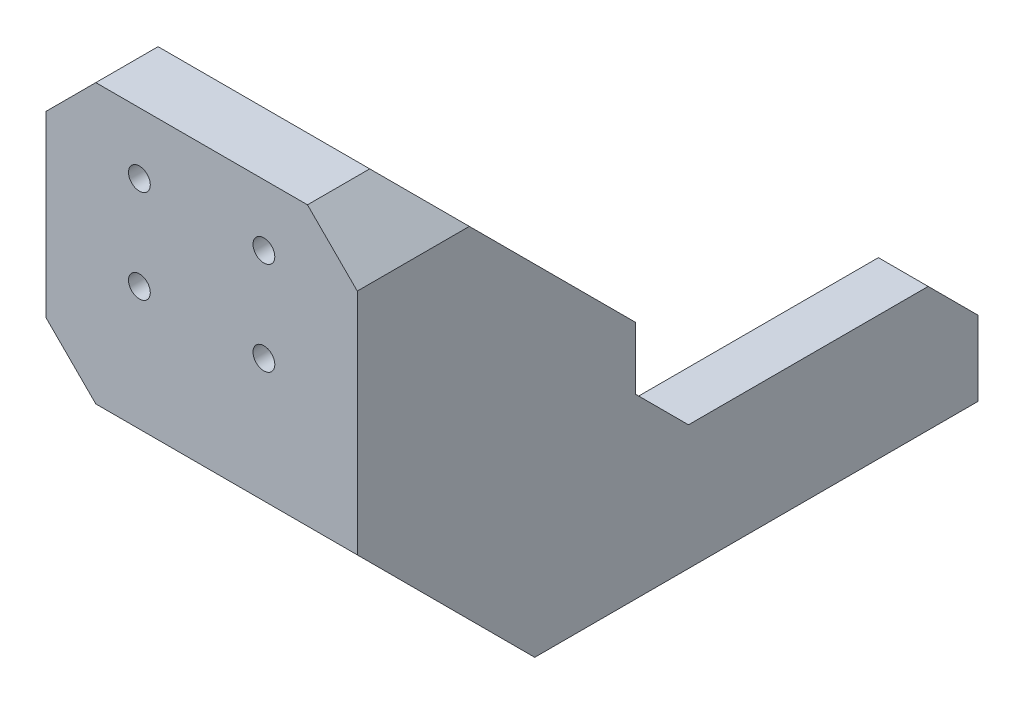
ISO-10303-21;
HEADER;
FILE_DESCRIPTION(('STEP AP214'),'2;1');
FILE_NAME('part.step','',(''),(''),'','','');
FILE_SCHEMA(('AUTOMOTIVE_DESIGN { 1 0 10303 214 1 1 1 1 }'));
ENDSEC;
DATA;
#1=APPLICATION_CONTEXT('core data for automotive mechanical design processes');
#2=APPLICATION_PROTOCOL_DEFINITION('international standard','automotive_design',2000,#1);
#3=PRODUCT_CONTEXT('',#1,'mechanical');
#4=PRODUCT('Part','Part','',(#3));
#5=PRODUCT_RELATED_PRODUCT_CATEGORY('part','',(#4));
#6=PRODUCT_DEFINITION_FORMATION('','',#4);
#7=PRODUCT_DEFINITION_CONTEXT('part definition',#1,'design');
#8=PRODUCT_DEFINITION('design','',#6,#7);
#9=PRODUCT_DEFINITION_SHAPE('','',#8);
#10=(LENGTH_UNIT() NAMED_UNIT(*) SI_UNIT(.MILLI.,.METRE.));
#11=(NAMED_UNIT(*) PLANE_ANGLE_UNIT() SI_UNIT($,.RADIAN.));
#12=(NAMED_UNIT(*) SI_UNIT($,.STERADIAN.) SOLID_ANGLE_UNIT());
#13=UNCERTAINTY_MEASURE_WITH_UNIT(LENGTH_MEASURE(1.E-05),#10,'distance_accuracy_value','');
#14=(GEOMETRIC_REPRESENTATION_CONTEXT(3) GLOBAL_UNCERTAINTY_ASSIGNED_CONTEXT((#13)) GLOBAL_UNIT_ASSIGNED_CONTEXT((#10,
#11,#12)) REPRESENTATION_CONTEXT('',''));
#15=CARTESIAN_POINT('',(0.,0.,0.));
#16=DIRECTION('',(0.,0.,1.));
#17=DIRECTION('',(1.,0.,0.));
#18=AXIS2_PLACEMENT_3D('',#15,#16,#17);
#19=CARTESIAN_POINT('',(0.,10.,0.));
#20=DIRECTION('',(0.,-1.,0.));
#21=DIRECTION('',(0.,0.,-1.));
#22=AXIS2_PLACEMENT_3D('',#19,#20,#21);
#23=PLANE('',#22);
#24=CARTESIAN_POINT('',(-10.,10.,-7.5));
#25=DIRECTION('',(0.,1.,0.));
#26=DIRECTION('',(0.,0.,1.));
#27=AXIS2_PLACEMENT_3D('',#24,#25,#26);
#28=CIRCLE('',#27,3.);
#29=CARTESIAN_POINT('',(-10.,10.,-4.5));
#30=VERTEX_POINT('',#29);
#31=EDGE_CURVE('E269',#30,#30,#28,.T.);
#32=ORIENTED_EDGE('',*,*,#31,.F.);
#33=EDGE_LOOP('',(#32));
#34=FACE_BOUND('',#33,.T.);
#35=CARTESIAN_POINT('',(10.,10.,7.5));
#36=DIRECTION('',(0.,1.,0.));
#37=DIRECTION('',(0.,0.,1.));
#38=AXIS2_PLACEMENT_3D('',#35,#36,#37);
#39=CIRCLE('',#38,3.);
#40=CARTESIAN_POINT('',(10.,10.,10.5));
#41=VERTEX_POINT('',#40);
#42=EDGE_CURVE('E275',#41,#41,#39,.T.);
#43=ORIENTED_EDGE('',*,*,#42,.F.);
#44=EDGE_LOOP('',(#43));
#45=FACE_BOUND('',#44,.T.);
#46=CARTESIAN_POINT('',(-10.,10.,7.5));
#47=DIRECTION('',(0.,1.,0.));
#48=DIRECTION('',(0.,0.,1.));
#49=AXIS2_PLACEMENT_3D('',#46,#47,#48);
#50=CIRCLE('',#49,3.);
#51=CARTESIAN_POINT('',(-10.,10.,10.5));
#52=VERTEX_POINT('',#51);
#53=EDGE_CURVE('E276',#52,#52,#50,.T.);
#54=ORIENTED_EDGE('',*,*,#53,.F.);
#55=EDGE_LOOP('',(#54));
#56=FACE_BOUND('',#55,.T.);
#57=CARTESIAN_POINT('',(10.,10.,-7.5));
#58=DIRECTION('',(0.,1.,0.));
#59=DIRECTION('',(0.,0.,1.));
#60=AXIS2_PLACEMENT_3D('',#57,#58,#59);
#61=CIRCLE('',#60,3.);
#62=CARTESIAN_POINT('',(10.,10.,-4.5));
#63=VERTEX_POINT('',#62);
#64=EDGE_CURVE('E266',#63,#63,#61,.T.);
#65=ORIENTED_EDGE('',*,*,#64,.F.);
#66=EDGE_LOOP('',(#65));
#67=FACE_BOUND('',#66,.T.);
#68=DIRECTION('',(0.,0.,-1.));
#69=VECTOR('',#68,1.);
#70=CARTESIAN_POINT('',(-17.,10.,-17.35));
#71=LINE('',#70,#69);
#72=CARTESIAN_POINT('',(-17.,10.,17.35));
#73=VERTEX_POINT('',#72);
#74=CARTESIAN_POINT('',(-17.,10.,-17.35));
#75=VERTEX_POINT('',#74);
#76=EDGE_CURVE('E196',#73,#75,#71,.T.);
#77=ORIENTED_EDGE('',*,*,#76,.F.);
#78=DIRECTION('',(1.,0.,0.));
#79=VECTOR('',#78,1.);
#80=CARTESIAN_POINT('',(-25.,10.,17.35));
#81=LINE('',#80,#79);
#82=CARTESIAN_POINT('',(17.,10.,17.35));
#83=VERTEX_POINT('',#82);
#84=EDGE_CURVE('E191',#73,#83,#81,.T.);
#85=ORIENTED_EDGE('',*,*,#84,.T.);
#86=DIRECTION('',(0.,0.,-1.));
#87=VECTOR('',#86,1.);
#88=CARTESIAN_POINT('',(17.,10.,-17.35));
#89=LINE('',#88,#87);
#90=CARTESIAN_POINT('',(17.,10.,-17.35));
#91=VERTEX_POINT('',#90);
#92=EDGE_CURVE('E341',#83,#91,#89,.T.);
#93=ORIENTED_EDGE('',*,*,#92,.T.);
#94=DIRECTION('',(-1.,0.,0.));
#95=VECTOR('',#94,1.);
#96=CARTESIAN_POINT('',(-25.,10.,-17.35));
#97=LINE('',#96,#95);
#98=EDGE_CURVE('E249',#91,#75,#97,.T.);
#99=ORIENTED_EDGE('',*,*,#98,.T.);
#100=EDGE_LOOP('',(#77,#85,#93,#99));
#101=FACE_BOUND('',#100,.T.);
#102=ADVANCED_FACE('F41',(#34,#45,#56,#67,#101),#23,.F.);
#103=CARTESIAN_POINT('',(-25.,44.7,17.35));
#104=DIRECTION('',(0.,0.,-1.));
#105=DIRECTION('',(-1.,0.,0.));
#106=AXIS2_PLACEMENT_3D('',#103,#104,#105);
#107=PLANE('',#106);
#108=CARTESIAN_POINT('',(10.,19.85,17.35));
#109=DIRECTION('',(0.,0.,-1.));
#110=DIRECTION('',(-1.,0.,0.));
#111=AXIS2_PLACEMENT_3D('',#108,#109,#110);
#112=CIRCLE('',#111,1.75);
#113=CARTESIAN_POINT('',(8.25,19.85,17.35));
#114=VERTEX_POINT('',#113);
#115=EDGE_CURVE('E354',#114,#114,#112,.T.);
#116=ORIENTED_EDGE('',*,*,#115,.F.);
#117=EDGE_LOOP('',(#116));
#118=FACE_BOUND('',#117,.T.);
#119=CARTESIAN_POINT('',(-10.,19.85,17.35));
#120=DIRECTION('',(0.,0.,-1.));
#121=DIRECTION('',(-1.,0.,0.));
#122=AXIS2_PLACEMENT_3D('',#119,#120,#121);
#123=CIRCLE('',#122,1.75);
#124=CARTESIAN_POINT('',(-11.75,19.85,17.35));
#125=VERTEX_POINT('',#124);
#126=EDGE_CURVE('E360',#125,#125,#123,.T.);
#127=ORIENTED_EDGE('',*,*,#126,.F.);
#128=EDGE_LOOP('',(#127));
#129=FACE_BOUND('',#128,.T.);
#130=CARTESIAN_POINT('',(-10.,34.85,17.35));
#131=DIRECTION('',(0.,0.,-1.));
#132=DIRECTION('',(-1.,0.,0.));
#133=AXIS2_PLACEMENT_3D('',#130,#131,#132);
#134=CIRCLE('',#133,1.75);
#135=CARTESIAN_POINT('',(-11.75,34.85,17.35));
#136=VERTEX_POINT('',#135);
#137=EDGE_CURVE('E366',#136,#136,#134,.T.);
#138=ORIENTED_EDGE('',*,*,#137,.F.);
#139=EDGE_LOOP('',(#138));
#140=FACE_BOUND('',#139,.T.);
#141=CARTESIAN_POINT('',(10.,34.85,17.35));
#142=DIRECTION('',(0.,0.,-1.));
#143=DIRECTION('',(-1.,0.,0.));
#144=AXIS2_PLACEMENT_3D('',#141,#142,#143);
#145=CIRCLE('',#144,1.75);
#146=CARTESIAN_POINT('',(8.25,34.85,17.35));
#147=VERTEX_POINT('',#146);
#148=EDGE_CURVE('E346',#147,#147,#145,.T.);
#149=ORIENTED_EDGE('',*,*,#148,.F.);
#150=EDGE_LOOP('',(#149));
#151=FACE_BOUND('',#150,.T.);
#152=ORIENTED_EDGE('',*,*,#84,.F.);
#153=DIRECTION('',(0.,-1.,0.));
#154=VECTOR('',#153,1.);
#155=CARTESIAN_POINT('',(-17.,10.,17.35));
#156=LINE('',#155,#154);
#157=CARTESIAN_POINT('',(-17.,44.7,17.35));
#158=VERTEX_POINT('',#157);
#159=EDGE_CURVE('E189',#158,#73,#156,.T.);
#160=ORIENTED_EDGE('',*,*,#159,.F.);
#161=DIRECTION('',(1.,0.,0.));
#162=VECTOR('',#161,1.);
#163=CARTESIAN_POINT('',(-25.,44.7,17.35));
#164=LINE('',#163,#162);
#165=CARTESIAN_POINT('',(17.,44.7,17.35));
#166=VERTEX_POINT('',#165);
#167=EDGE_CURVE('E174',#158,#166,#164,.T.);
#168=ORIENTED_EDGE('',*,*,#167,.T.);
#169=DIRECTION('',(0.,-1.,0.));
#170=VECTOR('',#169,1.);
#171=CARTESIAN_POINT('',(17.,10.,17.35));
#172=LINE('',#171,#170);
#173=EDGE_CURVE('E338',#166,#83,#172,.T.);
#174=ORIENTED_EDGE('',*,*,#173,.T.);
#175=EDGE_LOOP('',(#152,#160,#168,#174));
#176=FACE_BOUND('',#175,.T.);
#177=ADVANCED_FACE('F190',(#118,#129,#140,#151,#176),#107,.T.);
#178=CARTESIAN_POINT('',(0.,0.,0.));
#179=DIRECTION('',(0.,-1.,0.));
#180=DIRECTION('',(0.,0.,-1.));
#181=AXIS2_PLACEMENT_3D('',#178,#179,#180);
#182=PLANE('',#181);
#183=CARTESIAN_POINT('',(-10.,0.,7.5));
#184=DIRECTION('',(0.,-1.,0.));
#185=DIRECTION('',(0.,0.,-1.));
#186=AXIS2_PLACEMENT_3D('',#183,#184,#185);
#187=CIRCLE('',#186,1.75);
#188=CARTESIAN_POINT('',(-10.,0.,5.75));
#189=VERTEX_POINT('',#188);
#190=EDGE_CURVE('E230',#189,#189,#187,.F.);
#191=ORIENTED_EDGE('',*,*,#190,.T.);
#192=EDGE_LOOP('',(#191));
#193=FACE_BOUND('',#192,.T.);
#194=CARTESIAN_POINT('',(10.,0.,7.5));
#195=DIRECTION('',(0.,-1.,0.));
#196=DIRECTION('',(0.,0.,-1.));
#197=AXIS2_PLACEMENT_3D('',#194,#195,#196);
#198=CIRCLE('',#197,1.75);
#199=CARTESIAN_POINT('',(10.,0.,5.75));
#200=VERTEX_POINT('',#199);
#201=EDGE_CURVE('E261',#200,#200,#198,.F.);
#202=ORIENTED_EDGE('',*,*,#201,.T.);
#203=EDGE_LOOP('',(#202));
#204=FACE_BOUND('',#203,.T.);
#205=CARTESIAN_POINT('',(10.,0.,-7.5));
#206=DIRECTION('',(0.,-1.,0.));
#207=DIRECTION('',(0.,0.,-1.));
#208=AXIS2_PLACEMENT_3D('',#205,#206,#207);
#209=CIRCLE('',#208,1.75);
#210=CARTESIAN_POINT('',(10.,0.,-9.25));
#211=VERTEX_POINT('',#210);
#212=EDGE_CURVE('E258',#211,#211,#209,.F.);
#213=ORIENTED_EDGE('',*,*,#212,.T.);
#214=EDGE_LOOP('',(#213));
#215=FACE_BOUND('',#214,.T.);
#216=CARTESIAN_POINT('',(-10.,0.,-7.5));
#217=DIRECTION('',(0.,-1.,0.));
#218=DIRECTION('',(0.,0.,-1.));
#219=AXIS2_PLACEMENT_3D('',#216,#217,#218);
#220=CIRCLE('',#219,1.75);
#221=CARTESIAN_POINT('',(-10.,0.,-9.25));
#222=VERTEX_POINT('',#221);
#223=EDGE_CURVE('E255',#222,#222,#220,.F.);
#224=ORIENTED_EDGE('',*,*,#223,.T.);
#225=EDGE_LOOP('',(#224));
#226=FACE_BOUND('',#225,.T.);
#227=DIRECTION('',(-1.,0.,0.));
#228=VECTOR('',#227,1.);
#229=CARTESIAN_POINT('',(-25.,0.,27.35));
#230=LINE('',#229,#228);
#231=CARTESIAN_POINT('',(17.,0.,27.35));
#232=VERTEX_POINT('',#231);
#233=CARTESIAN_POINT('',(-17.,0.,27.35));
#234=VERTEX_POINT('',#233);
#235=EDGE_CURVE('E296',#232,#234,#230,.T.);
#236=ORIENTED_EDGE('',*,*,#235,.T.);
#237=DIRECTION('',(0.,0.,-1.));
#238=VECTOR('',#237,1.);
#239=CARTESIAN_POINT('',(-17.,0.,-17.35));
#240=LINE('',#239,#238);
#241=CARTESIAN_POINT('',(-17.,0.,-17.35));
#242=VERTEX_POINT('',#241);
#243=EDGE_CURVE('E63',#234,#242,#240,.T.);
#244=ORIENTED_EDGE('',*,*,#243,.T.);
#245=DIRECTION('',(-1.,0.,0.));
#246=VECTOR('',#245,1.);
#247=CARTESIAN_POINT('',(-25.,0.,-17.35));
#248=LINE('',#247,#246);
#249=CARTESIAN_POINT('',(17.,0.,-17.35));
#250=VERTEX_POINT('',#249);
#251=EDGE_CURVE('E250',#250,#242,#248,.T.);
#252=ORIENTED_EDGE('',*,*,#251,.F.);
#253=DIRECTION('',(0.,0.,1.));
#254=VECTOR('',#253,1.);
#255=CARTESIAN_POINT('',(17.,0.,27.35));
#256=LINE('',#255,#254);
#257=EDGE_CURVE('E301',#250,#232,#256,.T.);
#258=ORIENTED_EDGE('',*,*,#257,.T.);
#259=EDGE_LOOP('',(#236,#244,#252,#258));
#260=FACE_BOUND('',#259,.T.);
#261=ADVANCED_FACE('F385',(#193,#204,#215,#226,#260),#182,.T.);
#262=CARTESIAN_POINT('',(-10.,-0.000999999999999265,-7.5));
#263=DIRECTION('',(0.,1.,0.));
#264=DIRECTION('',(0.,0.,1.));
#265=AXIS2_PLACEMENT_3D('',#262,#263,#264);
#266=CYLINDRICAL_SURFACE('',#265,1.75);
#267=ORIENTED_EDGE('',*,*,#223,.F.);
#268=EDGE_LOOP('',(#267));
#269=FACE_BOUND('',#268,.T.);
#270=CARTESIAN_POINT('',(-10.,5.,-7.5));
#271=DIRECTION('',(0.,1.,0.));
#272=DIRECTION('',(0.,0.,1.));
#273=AXIS2_PLACEMENT_3D('',#270,#271,#272);
#274=CIRCLE('',#273,1.75);
#275=CARTESIAN_POINT('',(-10.,5.,-5.75));
#276=VERTEX_POINT('',#275);
#277=EDGE_CURVE('E227',#276,#276,#274,.F.);
#278=ORIENTED_EDGE('',*,*,#277,.F.);
#279=EDGE_LOOP('',(#278));
#280=FACE_BOUND('',#279,.T.);
#281=ADVANCED_FACE('F409',(#269,#280),#266,.F.);
#282=CARTESIAN_POINT('',(10.,-0.000999999999999265,-7.5));
#283=DIRECTION('',(0.,1.,0.));
#284=DIRECTION('',(0.,0.,1.));
#285=AXIS2_PLACEMENT_3D('',#282,#283,#284);
#286=CYLINDRICAL_SURFACE('',#285,1.75);
#287=ORIENTED_EDGE('',*,*,#212,.F.);
#288=EDGE_LOOP('',(#287));
#289=FACE_BOUND('',#288,.T.);
#290=CARTESIAN_POINT('',(10.,5.,-7.5));
#291=DIRECTION('',(0.,1.,0.));
#292=DIRECTION('',(0.,0.,1.));
#293=AXIS2_PLACEMENT_3D('',#290,#291,#292);
#294=CIRCLE('',#293,1.75);
#295=CARTESIAN_POINT('',(10.,5.,-5.75));
#296=VERTEX_POINT('',#295);
#297=EDGE_CURVE('E231',#296,#296,#294,.F.);
#298=ORIENTED_EDGE('',*,*,#297,.F.);
#299=EDGE_LOOP('',(#298));
#300=FACE_BOUND('',#299,.T.);
#301=ADVANCED_FACE('F548',(#289,#300),#286,.F.);
#302=CARTESIAN_POINT('',(10.,-0.000999999999999265,7.5));
#303=DIRECTION('',(0.,1.,0.));
#304=DIRECTION('',(0.,0.,1.));
#305=AXIS2_PLACEMENT_3D('',#302,#303,#304);
#306=CYLINDRICAL_SURFACE('',#305,1.75);
#307=ORIENTED_EDGE('',*,*,#201,.F.);
#308=EDGE_LOOP('',(#307));
#309=FACE_BOUND('',#308,.T.);
#310=CARTESIAN_POINT('',(10.,5.,7.5));
#311=DIRECTION('',(0.,1.,0.));
#312=DIRECTION('',(0.,0.,1.));
#313=AXIS2_PLACEMENT_3D('',#310,#311,#312);
#314=CIRCLE('',#313,1.75);
#315=CARTESIAN_POINT('',(10.,5.,9.25));
#316=VERTEX_POINT('',#315);
#317=EDGE_CURVE('E234',#316,#316,#314,.F.);
#318=ORIENTED_EDGE('',*,*,#317,.F.);
#319=EDGE_LOOP('',(#318));
#320=FACE_BOUND('',#319,.T.);
#321=ADVANCED_FACE('F551',(#309,#320),#306,.F.);
#322=CARTESIAN_POINT('',(-10.,-0.000999999999999265,7.5));
#323=DIRECTION('',(0.,1.,0.));
#324=DIRECTION('',(0.,0.,1.));
#325=AXIS2_PLACEMENT_3D('',#322,#323,#324);
#326=CYLINDRICAL_SURFACE('',#325,1.75);
#327=ORIENTED_EDGE('',*,*,#190,.F.);
#328=EDGE_LOOP('',(#327));
#329=FACE_BOUND('',#328,.T.);
#330=CARTESIAN_POINT('',(-10.,5.,7.5));
#331=DIRECTION('',(0.,1.,0.));
#332=DIRECTION('',(0.,0.,1.));
#333=AXIS2_PLACEMENT_3D('',#330,#331,#332);
#334=CIRCLE('',#333,1.75);
#335=CARTESIAN_POINT('',(-10.,5.,9.25));
#336=VERTEX_POINT('',#335);
#337=EDGE_CURVE('E237',#336,#336,#334,.F.);
#338=ORIENTED_EDGE('',*,*,#337,.F.);
#339=EDGE_LOOP('',(#338));
#340=FACE_BOUND('',#339,.T.);
#341=ADVANCED_FACE('F426',(#329,#340),#326,.F.);
#342=CARTESIAN_POINT('',(25.,10.,17.35));
#343=DIRECTION('',(-1.,0.,0.));
#344=DIRECTION('',(0.,0.,1.));
#345=AXIS2_PLACEMENT_3D('',#342,#343,#344);
#346=PLANE('',#345);
#347=DIRECTION('',(0.,0.707106781186548,0.707106781186548));
#348=VECTOR('',#347,1.);
#349=CARTESIAN_POINT('',(25.,44.7,17.35));
#350=LINE('',#349,#348);
#351=CARTESIAN_POINT('',(25.,10.,-17.35));
#352=VERTEX_POINT('',#351);
#353=CARTESIAN_POINT('',(25.,36.7,9.34999999999997));
#354=VERTEX_POINT('',#353);
#355=EDGE_CURVE('E336',#352,#354,#350,.T.);
#356=ORIENTED_EDGE('',*,*,#355,.T.);
#357=DIRECTION('',(0.,0.,1.));
#358=VECTOR('',#357,1.);
#359=CARTESIAN_POINT('',(25.,36.7,27.35));
#360=LINE('',#359,#358);
#361=CARTESIAN_POINT('',(25.,36.7,27.35));
#362=VERTEX_POINT('',#361);
#363=EDGE_CURVE('E50',#354,#362,#360,.T.);
#364=ORIENTED_EDGE('',*,*,#363,.T.);
#365=DIRECTION('',(0.,-1.,0.));
#366=VECTOR('',#365,1.);
#367=CARTESIAN_POINT('',(25.,44.7,27.35));
#368=LINE('',#367,#366);
#369=CARTESIAN_POINT('',(25.,0.,27.35));
#370=VERTEX_POINT('',#369);
#371=EDGE_CURVE('E290',#362,#370,#368,.T.);
#372=ORIENTED_EDGE('',*,*,#371,.T.);
#373=DIRECTION('',(0.,-0.707106781186549,-0.707106781186546));
#374=VECTOR('',#373,1.);
#375=CARTESIAN_POINT('',(25.,-28.5,-1.14999999999991));
#376=LINE('',#375,#374);
#377=CARTESIAN_POINT('',(25.,-28.5,-1.14999999999991));
#378=VERTEX_POINT('',#377);
#379=EDGE_CURVE('E318',#370,#378,#376,.T.);
#380=ORIENTED_EDGE('',*,*,#379,.T.);
#381=DIRECTION('',(0.,0.,-1.));
#382=VECTOR('',#381,1.);
#383=CARTESIAN_POINT('',(25.,-28.5,-72.35));
#384=LINE('',#383,#382);
#385=CARTESIAN_POINT('',(25.,-28.5,-72.35));
#386=VERTEX_POINT('',#385);
#387=EDGE_CURVE('E315',#378,#386,#384,.T.);
#388=ORIENTED_EDGE('',*,*,#387,.T.);
#389=DIRECTION('',(0.,1.,0.));
#390=VECTOR('',#389,1.);
#391=CARTESIAN_POINT('',(25.,-8.5,-72.35));
#392=LINE('',#391,#390);
#393=CARTESIAN_POINT('',(25.,-16.5,-72.35));
#394=VERTEX_POINT('',#393);
#395=EDGE_CURVE('E312',#386,#394,#392,.T.);
#396=ORIENTED_EDGE('',*,*,#395,.T.);
#397=DIRECTION('',(0.,-0.707106781186546,-0.707106781186549));
#398=VECTOR('',#397,1.);
#399=CARTESIAN_POINT('',(25.,-16.5,-72.35));
#400=LINE('',#399,#398);
#401=CARTESIAN_POINT('',(25.,-8.5,-64.35));
#402=VERTEX_POINT('',#401);
#403=EDGE_CURVE('E221',#394,#402,#400,.F.);
#404=ORIENTED_EDGE('',*,*,#403,.T.);
#405=DIRECTION('',(0.,0.,1.));
#406=VECTOR('',#405,1.);
#407=CARTESIAN_POINT('',(25.,-8.5,-25.85));
#408=LINE('',#407,#406);
#409=CARTESIAN_POINT('',(25.,-8.5,-25.85));
#410=VERTEX_POINT('',#409);
#411=EDGE_CURVE('E310',#402,#410,#408,.T.);
#412=ORIENTED_EDGE('',*,*,#411,.T.);
#413=DIRECTION('',(0.,0.707106781186549,0.707106781186547));
#414=VECTOR('',#413,1.);
#415=CARTESIAN_POINT('',(25.,0.,-17.35));
#416=LINE('',#415,#414);
#417=CARTESIAN_POINT('',(25.,0.,-17.35));
#418=VERTEX_POINT('',#417);
#419=EDGE_CURVE('E306',#410,#418,#416,.T.);
#420=ORIENTED_EDGE('',*,*,#419,.T.);
#421=DIRECTION('',(0.,-1.,0.));
#422=VECTOR('',#421,1.);
#423=CARTESIAN_POINT('',(25.,10.,-17.35));
#424=LINE('',#423,#422);
#425=EDGE_CURVE('E226',#352,#418,#424,.T.);
#426=ORIENTED_EDGE('',*,*,#425,.F.);
#427=EDGE_LOOP('',(#356,#364,#372,#380,#388,#396,#404,#412,#420,#426));
#428=FACE_BOUND('',#427,.T.);
#429=ADVANCED_FACE('F422',(#428),#346,.F.);
#430=CARTESIAN_POINT('',(-25.,10.,-17.35));
#431=DIRECTION('',(0.,0.,1.));
#432=DIRECTION('',(1.,0.,0.));
#433=AXIS2_PLACEMENT_3D('',#430,#431,#432);
#434=PLANE('',#433);
#435=ORIENTED_EDGE('',*,*,#251,.T.);
#436=DIRECTION('',(-0.707106781186549,0.707106781186546,0.));
#437=VECTOR('',#436,1.);
#438=CARTESIAN_POINT('',(-25.,7.99999999999999,-17.35));
#439=LINE('',#438,#437);
#440=CARTESIAN_POINT('',(-25.,7.99999999999999,-17.35));
#441=VERTEX_POINT('',#440);
#442=EDGE_CURVE('E170',#242,#441,#439,.T.);
#443=ORIENTED_EDGE('',*,*,#442,.T.);
#444=DIRECTION('',(0.,-1.,0.));
#445=VECTOR('',#444,1.);
#446=CARTESIAN_POINT('',(-25.,10.,-17.35));
#447=LINE('',#446,#445);
#448=CARTESIAN_POINT('',(-25.,10.,-17.35));
#449=VERTEX_POINT('',#448);
#450=EDGE_CURVE('E243',#449,#441,#447,.T.);
#451=ORIENTED_EDGE('',*,*,#450,.F.);
#452=DIRECTION('',(-1.,0.,0.));
#453=VECTOR('',#452,1.);
#454=CARTESIAN_POINT('',(-17.,10.,-17.35));
#455=LINE('',#454,#453);
#456=EDGE_CURVE('E339',#75,#449,#455,.T.);
#457=ORIENTED_EDGE('',*,*,#456,.F.);
#458=ORIENTED_EDGE('',*,*,#98,.F.);
#459=EDGE_CURVE('E252',#352,#91,#97,.T.);
#460=ORIENTED_EDGE('',*,*,#459,.F.);
#461=ORIENTED_EDGE('',*,*,#425,.T.);
#462=EDGE_CURVE('E246',#418,#250,#248,.T.);
#463=ORIENTED_EDGE('',*,*,#462,.T.);
#464=EDGE_LOOP('',(#435,#443,#451,#457,#458,#460,#461,#463));
#465=FACE_BOUND('',#464,.T.);
#466=ADVANCED_FACE('F418',(#465),#434,.F.);
#467=CARTESIAN_POINT('',(-25.,10.,17.35));
#468=DIRECTION('',(1.,0.,0.));
#469=DIRECTION('',(0.,0.,-1.));
#470=AXIS2_PLACEMENT_3D('',#467,#468,#469);
#471=PLANE('',#470);
#472=ORIENTED_EDGE('',*,*,#450,.T.);
#473=DIRECTION('',(0.,0.,1.));
#474=VECTOR('',#473,1.);
#475=CARTESIAN_POINT('',(-25.,7.99999999999999,27.35));
#476=LINE('',#475,#474);
#477=CARTESIAN_POINT('',(-25.,8.00000000000001,27.35));
#478=VERTEX_POINT('',#477);
#479=EDGE_CURVE('E212',#441,#478,#476,.T.);
#480=ORIENTED_EDGE('',*,*,#479,.T.);
#481=DIRECTION('',(0.,-1.,0.));
#482=VECTOR('',#481,1.);
#483=CARTESIAN_POINT('',(-25.,44.7,27.35));
#484=LINE('',#483,#482);
#485=CARTESIAN_POINT('',(-25.,36.7,27.35));
#486=VERTEX_POINT('',#485);
#487=EDGE_CURVE('E287',#486,#478,#484,.T.);
#488=ORIENTED_EDGE('',*,*,#487,.F.);
#489=DIRECTION('',(0.,0.,-1.));
#490=VECTOR('',#489,1.);
#491=CARTESIAN_POINT('',(-25.,36.7,17.35));
#492=LINE('',#491,#490);
#493=CARTESIAN_POINT('',(-25.,36.7,9.34999999999997));
#494=VERTEX_POINT('',#493);
#495=EDGE_CURVE('E215',#486,#494,#492,.T.);
#496=ORIENTED_EDGE('',*,*,#495,.T.);
#497=DIRECTION('',(0.,0.707106781186548,0.707106781186548));
#498=VECTOR('',#497,1.);
#499=CARTESIAN_POINT('',(-25.,44.7,17.35));
#500=LINE('',#499,#498);
#501=EDGE_CURVE('E164',#449,#494,#500,.T.);
#502=ORIENTED_EDGE('',*,*,#501,.F.);
#503=EDGE_LOOP('',(#472,#480,#488,#496,#502));
#504=FACE_BOUND('',#503,.T.);
#505=ADVANCED_FACE('F414',(#504),#471,.F.);
#506=CARTESIAN_POINT('',(-10.,5.,7.5));
#507=DIRECTION('',(0.,1.,0.));
#508=DIRECTION('',(0.,0.,1.));
#509=AXIS2_PLACEMENT_3D('',#506,#507,#508);
#510=PLANE('',#509);
#511=CARTESIAN_POINT('',(-10.,5.,7.5));
#512=DIRECTION('',(0.,1.,0.));
#513=DIRECTION('',(0.,0.,1.));
#514=AXIS2_PLACEMENT_3D('',#511,#512,#513);
#515=CIRCLE('',#514,3.);
#516=CARTESIAN_POINT('',(-10.,5.,10.5));
#517=VERTEX_POINT('',#516);
#518=EDGE_CURVE('E284',#517,#517,#515,.T.);
#519=ORIENTED_EDGE('',*,*,#518,.T.);
#520=EDGE_LOOP('',(#519));
#521=FACE_BOUND('',#520,.T.);
#522=ORIENTED_EDGE('',*,*,#337,.T.);
#523=EDGE_LOOP('',(#522));
#524=FACE_BOUND('',#523,.T.);
#525=ADVANCED_FACE('F417',(#521,#524),#510,.T.);
#526=CARTESIAN_POINT('',(-10.,5.,7.5));
#527=DIRECTION('',(0.,1.,0.));
#528=DIRECTION('',(0.,0.,1.));
#529=AXIS2_PLACEMENT_3D('',#526,#527,#528);
#530=CYLINDRICAL_SURFACE('',#529,3.);
#531=ORIENTED_EDGE('',*,*,#518,.F.);
#532=EDGE_LOOP('',(#531));
#533=FACE_BOUND('',#532,.T.);
#534=ORIENTED_EDGE('',*,*,#53,.T.);
#535=EDGE_LOOP('',(#534));
#536=FACE_BOUND('',#535,.T.);
#537=ADVANCED_FACE('F518',(#533,#536),#530,.F.);
#538=CARTESIAN_POINT('',(10.,5.,7.5));
#539=DIRECTION('',(0.,1.,0.));
#540=DIRECTION('',(0.,0.,1.));
#541=AXIS2_PLACEMENT_3D('',#538,#539,#540);
#542=PLANE('',#541);
#543=CARTESIAN_POINT('',(10.,5.,7.5));
#544=DIRECTION('',(0.,1.,0.));
#545=DIRECTION('',(0.,0.,1.));
#546=AXIS2_PLACEMENT_3D('',#543,#544,#545);
#547=CIRCLE('',#546,3.);
#548=CARTESIAN_POINT('',(10.,5.,10.5));
#549=VERTEX_POINT('',#548);
#550=EDGE_CURVE('E272',#549,#549,#547,.T.);
#551=ORIENTED_EDGE('',*,*,#550,.T.);
#552=EDGE_LOOP('',(#551));
#553=FACE_BOUND('',#552,.T.);
#554=ORIENTED_EDGE('',*,*,#317,.T.);
#555=EDGE_LOOP('',(#554));
#556=FACE_BOUND('',#555,.T.);
#557=ADVANCED_FACE('F521',(#553,#556),#542,.T.);
#558=CARTESIAN_POINT('',(10.,5.,7.5));
#559=DIRECTION('',(0.,1.,0.));
#560=DIRECTION('',(0.,0.,1.));
#561=AXIS2_PLACEMENT_3D('',#558,#559,#560);
#562=CYLINDRICAL_SURFACE('',#561,3.);
#563=ORIENTED_EDGE('',*,*,#550,.F.);
#564=EDGE_LOOP('',(#563));
#565=FACE_BOUND('',#564,.T.);
#566=ORIENTED_EDGE('',*,*,#42,.T.);
#567=EDGE_LOOP('',(#566));
#568=FACE_BOUND('',#567,.T.);
#569=ADVANCED_FACE('F534',(#565,#568),#562,.F.);
#570=CARTESIAN_POINT('',(10.,5.,-7.5));
#571=DIRECTION('',(0.,1.,0.));
#572=DIRECTION('',(0.,0.,1.));
#573=AXIS2_PLACEMENT_3D('',#570,#571,#572);
#574=PLANE('',#573);
#575=CARTESIAN_POINT('',(10.,5.,-7.5));
#576=DIRECTION('',(0.,1.,0.));
#577=DIRECTION('',(0.,0.,1.));
#578=AXIS2_PLACEMENT_3D('',#575,#576,#577);
#579=CIRCLE('',#578,3.);
#580=CARTESIAN_POINT('',(10.,5.,-4.5));
#581=VERTEX_POINT('',#580);
#582=EDGE_CURVE('E240',#581,#581,#579,.T.);
#583=ORIENTED_EDGE('',*,*,#582,.T.);
#584=EDGE_LOOP('',(#583));
#585=FACE_BOUND('',#584,.T.);
#586=ORIENTED_EDGE('',*,*,#297,.T.);
#587=EDGE_LOOP('',(#586));
#588=FACE_BOUND('',#587,.T.);
#589=ADVANCED_FACE('F537',(#585,#588),#574,.T.);
#590=CARTESIAN_POINT('',(10.,5.,-7.5));
#591=DIRECTION('',(0.,1.,0.));
#592=DIRECTION('',(0.,0.,1.));
#593=AXIS2_PLACEMENT_3D('',#590,#591,#592);
#594=CYLINDRICAL_SURFACE('',#593,3.);
#595=ORIENTED_EDGE('',*,*,#582,.F.);
#596=EDGE_LOOP('',(#595));
#597=FACE_BOUND('',#596,.T.);
#598=ORIENTED_EDGE('',*,*,#64,.T.);
#599=EDGE_LOOP('',(#598));
#600=FACE_BOUND('',#599,.T.);
#601=ADVANCED_FACE('F532',(#597,#600),#594,.F.);
#602=CARTESIAN_POINT('',(-10.,5.,-7.5));
#603=DIRECTION('',(0.,1.,0.));
#604=DIRECTION('',(0.,0.,1.));
#605=AXIS2_PLACEMENT_3D('',#602,#603,#604);
#606=PLANE('',#605);
#607=CARTESIAN_POINT('',(-10.,5.,-7.5));
#608=DIRECTION('',(0.,1.,0.));
#609=DIRECTION('',(0.,0.,1.));
#610=AXIS2_PLACEMENT_3D('',#607,#608,#609);
#611=CIRCLE('',#610,3.);
#612=CARTESIAN_POINT('',(-10.,5.,-4.5));
#613=VERTEX_POINT('',#612);
#614=EDGE_CURVE('E279',#613,#613,#611,.T.);
#615=ORIENTED_EDGE('',*,*,#614,.T.);
#616=EDGE_LOOP('',(#615));
#617=FACE_BOUND('',#616,.T.);
#618=ORIENTED_EDGE('',*,*,#277,.T.);
#619=EDGE_LOOP('',(#618));
#620=FACE_BOUND('',#619,.T.);
#621=ADVANCED_FACE('F528',(#617,#620),#606,.T.);
#622=CARTESIAN_POINT('',(-10.,5.,-7.5));
#623=DIRECTION('',(0.,1.,0.));
#624=DIRECTION('',(0.,0.,1.));
#625=AXIS2_PLACEMENT_3D('',#622,#623,#624);
#626=CYLINDRICAL_SURFACE('',#625,3.);
#627=ORIENTED_EDGE('',*,*,#614,.F.);
#628=EDGE_LOOP('',(#627));
#629=FACE_BOUND('',#628,.T.);
#630=ORIENTED_EDGE('',*,*,#31,.T.);
#631=EDGE_LOOP('',(#630));
#632=FACE_BOUND('',#631,.T.);
#633=ADVANCED_FACE('F515',(#629,#632),#626,.F.);
#634=CARTESIAN_POINT('',(-25.,44.7,27.35));
#635=DIRECTION('',(0.,0.,1.));
#636=DIRECTION('',(1.,0.,0.));
#637=AXIS2_PLACEMENT_3D('',#634,#635,#636);
#638=PLANE('',#637);
#639=CARTESIAN_POINT('',(10.,19.85,27.35));
#640=DIRECTION('',(0.,0.,1.));
#641=DIRECTION('',(1.,0.,0.));
#642=AXIS2_PLACEMENT_3D('',#639,#640,#641);
#643=CIRCLE('',#642,1.75);
#644=CARTESIAN_POINT('',(11.75,19.85,27.35));
#645=VERTEX_POINT('',#644);
#646=EDGE_CURVE('E357',#645,#645,#643,.F.);
#647=ORIENTED_EDGE('',*,*,#646,.T.);
#648=EDGE_LOOP('',(#647));
#649=FACE_BOUND('',#648,.T.);
#650=CARTESIAN_POINT('',(-10.,19.85,27.35));
#651=DIRECTION('',(0.,0.,1.));
#652=DIRECTION('',(1.,0.,0.));
#653=AXIS2_PLACEMENT_3D('',#650,#651,#652);
#654=CIRCLE('',#653,1.75);
#655=CARTESIAN_POINT('',(-8.25,19.85,27.35));
#656=VERTEX_POINT('',#655);
#657=EDGE_CURVE('E363',#656,#656,#654,.F.);
#658=ORIENTED_EDGE('',*,*,#657,.T.);
#659=EDGE_LOOP('',(#658));
#660=FACE_BOUND('',#659,.T.);
#661=CARTESIAN_POINT('',(-10.,34.85,27.35));
#662=DIRECTION('',(0.,0.,1.));
#663=DIRECTION('',(1.,0.,0.));
#664=AXIS2_PLACEMENT_3D('',#661,#662,#663);
#665=CIRCLE('',#664,1.75);
#666=CARTESIAN_POINT('',(-8.25,34.85,27.35));
#667=VERTEX_POINT('',#666);
#668=EDGE_CURVE('E351',#667,#667,#665,.F.);
#669=ORIENTED_EDGE('',*,*,#668,.T.);
#670=EDGE_LOOP('',(#669));
#671=FACE_BOUND('',#670,.T.);
#672=CARTESIAN_POINT('',(10.,34.85,27.35));
#673=DIRECTION('',(0.,0.,1.));
#674=DIRECTION('',(1.,0.,0.));
#675=AXIS2_PLACEMENT_3D('',#672,#673,#674);
#676=CIRCLE('',#675,1.75);
#677=CARTESIAN_POINT('',(11.75,34.85,27.35));
#678=VERTEX_POINT('',#677);
#679=EDGE_CURVE('E348',#678,#678,#676,.F.);
#680=ORIENTED_EDGE('',*,*,#679,.T.);
#681=EDGE_LOOP('',(#680));
#682=FACE_BOUND('',#681,.T.);
#683=ORIENTED_EDGE('',*,*,#487,.T.);
#684=DIRECTION('',(0.707106781186549,-0.707106781186546,0.));
#685=VECTOR('',#684,1.);
#686=CARTESIAN_POINT('',(-43.35,26.3499999999999,27.35));
#687=LINE('',#686,#685);
#688=EDGE_CURVE('E207',#478,#234,#687,.T.);
#689=ORIENTED_EDGE('',*,*,#688,.T.);
#690=ORIENTED_EDGE('',*,*,#235,.F.);
#691=EDGE_CURVE('E185',#370,#232,#230,.T.);
#692=ORIENTED_EDGE('',*,*,#691,.F.);
#693=ORIENTED_EDGE('',*,*,#371,.F.);
#694=DIRECTION('',(-0.707106781186548,0.707106781186547,0.));
#695=VECTOR('',#694,1.);
#696=CARTESIAN_POINT('',(-4.00000000000005,65.7,27.35));
#697=LINE('',#696,#695);
#698=CARTESIAN_POINT('',(17.,44.7,27.35));
#699=VERTEX_POINT('',#698);
#700=EDGE_CURVE('E210',#362,#699,#697,.T.);
#701=ORIENTED_EDGE('',*,*,#700,.T.);
#702=DIRECTION('',(-1.,0.,0.));
#703=VECTOR('',#702,1.);
#704=CARTESIAN_POINT('',(-25.,44.7,27.35));
#705=LINE('',#704,#703);
#706=CARTESIAN_POINT('',(-17.,44.7,27.35));
#707=VERTEX_POINT('',#706);
#708=EDGE_CURVE('E184',#699,#707,#705,.T.);
#709=ORIENTED_EDGE('',*,*,#708,.T.);
#710=DIRECTION('',(-0.707106781186548,-0.707106781186547,0.));
#711=VECTOR('',#710,1.);
#712=CARTESIAN_POINT('',(-21.,40.7,27.35));
#713=LINE('',#712,#711);
#714=EDGE_CURVE('E200',#707,#486,#713,.T.);
#715=ORIENTED_EDGE('',*,*,#714,.T.);
#716=EDGE_LOOP('',(#683,#689,#690,#692,#693,#701,#709,#715));
#717=FACE_BOUND('',#716,.T.);
#718=ADVANCED_FACE('F372',(#649,#660,#671,#682,#717),#638,.T.);
#719=CARTESIAN_POINT('',(0.,44.7,0.));
#720=DIRECTION('',(0.,1.,0.));
#721=DIRECTION('',(0.,0.,1.));
#722=AXIS2_PLACEMENT_3D('',#719,#720,#721);
#723=PLANE('',#722);
#724=ORIENTED_EDGE('',*,*,#167,.F.);
#725=DIRECTION('',(0.,0.,1.));
#726=VECTOR('',#725,1.);
#727=CARTESIAN_POINT('',(-17.,44.7,27.35));
#728=LINE('',#727,#726);
#729=EDGE_CURVE('E178',#158,#707,#728,.T.);
#730=ORIENTED_EDGE('',*,*,#729,.T.);
#731=ORIENTED_EDGE('',*,*,#708,.F.);
#732=DIRECTION('',(0.,0.,-1.));
#733=VECTOR('',#732,1.);
#734=CARTESIAN_POINT('',(17.,44.7,17.35));
#735=LINE('',#734,#733);
#736=EDGE_CURVE('E169',#699,#166,#735,.T.);
#737=ORIENTED_EDGE('',*,*,#736,.T.);
#738=EDGE_LOOP('',(#724,#730,#731,#737));
#739=FACE_BOUND('',#738,.T.);
#740=ADVANCED_FACE('F176',(#739),#723,.T.);
#741=CARTESIAN_POINT('',(17.,-28.5,-1.14999999999991));
#742=DIRECTION('',(0.,-0.707106781186546,0.707106781186549));
#743=DIRECTION('',(0.,-0.707106781186549,-0.707106781186546));
#744=AXIS2_PLACEMENT_3D('',#741,#742,#743);
#745=PLANE('',#744);
#746=ORIENTED_EDGE('',*,*,#379,.F.);
#747=ORIENTED_EDGE('',*,*,#691,.T.);
#748=DIRECTION('',(0.,-0.707106781186549,-0.707106781186546));
#749=VECTOR('',#748,1.);
#750=CARTESIAN_POINT('',(17.,-28.5,-1.14999999999991));
#751=LINE('',#750,#749);
#752=CARTESIAN_POINT('',(17.,-28.5,-1.14999999999991));
#753=VERTEX_POINT('',#752);
#754=EDGE_CURVE('E309',#232,#753,#751,.T.);
#755=ORIENTED_EDGE('',*,*,#754,.T.);
#756=DIRECTION('',(1.,0.,0.));
#757=VECTOR('',#756,1.);
#758=CARTESIAN_POINT('',(17.,-28.5,-1.14999999999991));
#759=LINE('',#758,#757);
#760=EDGE_CURVE('E298',#753,#378,#759,.T.);
#761=ORIENTED_EDGE('',*,*,#760,.T.);
#762=EDGE_LOOP('',(#746,#747,#755,#761));
#763=FACE_BOUND('',#762,.T.);
#764=ADVANCED_FACE('F460',(#763),#745,.T.);
#765=CARTESIAN_POINT('',(17.,0.,-17.35));
#766=DIRECTION('',(0.,0.707106781186547,-0.707106781186549));
#767=DIRECTION('',(0.,0.707106781186549,0.707106781186547));
#768=AXIS2_PLACEMENT_3D('',#765,#766,#767);
#769=PLANE('',#768);
#770=ORIENTED_EDGE('',*,*,#419,.F.);
#771=DIRECTION('',(1.,0.,0.));
#772=VECTOR('',#771,1.);
#773=CARTESIAN_POINT('',(17.,-8.5,-25.85));
#774=LINE('',#773,#772);
#775=CARTESIAN_POINT('',(17.,-8.5,-25.85));
#776=VERTEX_POINT('',#775);
#777=EDGE_CURVE('E303',#776,#410,#774,.T.);
#778=ORIENTED_EDGE('',*,*,#777,.F.);
#779=DIRECTION('',(0.,0.707106781186549,0.707106781186547));
#780=VECTOR('',#779,1.);
#781=CARTESIAN_POINT('',(17.,0.,-17.35));
#782=LINE('',#781,#780);
#783=EDGE_CURVE('E324',#776,#250,#782,.T.);
#784=ORIENTED_EDGE('',*,*,#783,.T.);
#785=ORIENTED_EDGE('',*,*,#462,.F.);
#786=EDGE_LOOP('',(#770,#778,#784,#785));
#787=FACE_BOUND('',#786,.T.);
#788=ADVANCED_FACE('F501',(#787),#769,.T.);
#789=CARTESIAN_POINT('',(17.,-8.5,-25.85));
#790=DIRECTION('',(0.,1.,0.));
#791=DIRECTION('',(0.,0.,1.));
#792=AXIS2_PLACEMENT_3D('',#789,#790,#791);
#793=PLANE('',#792);
#794=ORIENTED_EDGE('',*,*,#411,.F.);
#795=DIRECTION('',(-1.,0.,0.));
#796=VECTOR('',#795,1.);
#797=CARTESIAN_POINT('',(17.,-8.5,-64.35));
#798=LINE('',#797,#796);
#799=CARTESIAN_POINT('',(17.,-8.5,-64.35));
#800=VERTEX_POINT('',#799);
#801=EDGE_CURVE('E219',#402,#800,#798,.T.);
#802=ORIENTED_EDGE('',*,*,#801,.T.);
#803=DIRECTION('',(0.,0.,1.));
#804=VECTOR('',#803,1.);
#805=CARTESIAN_POINT('',(17.,-8.5,-25.85));
#806=LINE('',#805,#804);
#807=EDGE_CURVE('E326',#800,#776,#806,.T.);
#808=ORIENTED_EDGE('',*,*,#807,.T.);
#809=ORIENTED_EDGE('',*,*,#777,.T.);
#810=EDGE_LOOP('',(#794,#802,#808,#809));
#811=FACE_BOUND('',#810,.T.);
#812=ADVANCED_FACE('F479',(#811),#793,.T.);
#813=CARTESIAN_POINT('',(17.,-8.5,-72.35));
#814=DIRECTION('',(0.,0.,-1.));
#815=DIRECTION('',(-1.,0.,0.));
#816=AXIS2_PLACEMENT_3D('',#813,#814,#815);
#817=PLANE('',#816);
#818=DIRECTION('',(0.,1.,0.));
#819=VECTOR('',#818,1.);
#820=CARTESIAN_POINT('',(17.,-8.5,-72.35));
#821=LINE('',#820,#819);
#822=CARTESIAN_POINT('',(17.,-28.5,-72.35));
#823=VERTEX_POINT('',#822);
#824=CARTESIAN_POINT('',(17.,-16.5,-72.35));
#825=VERTEX_POINT('',#824);
#826=EDGE_CURVE('E328',#823,#825,#821,.T.);
#827=ORIENTED_EDGE('',*,*,#826,.T.);
#828=DIRECTION('',(1.,0.,0.));
#829=VECTOR('',#828,1.);
#830=CARTESIAN_POINT('',(17.,-16.5,-72.35));
#831=LINE('',#830,#829);
#832=EDGE_CURVE('E223',#825,#394,#831,.T.);
#833=ORIENTED_EDGE('',*,*,#832,.T.);
#834=ORIENTED_EDGE('',*,*,#395,.F.);
#835=DIRECTION('',(1.,0.,0.));
#836=VECTOR('',#835,1.);
#837=CARTESIAN_POINT('',(17.,-28.5,-72.35));
#838=LINE('',#837,#836);
#839=EDGE_CURVE('E300',#823,#386,#838,.T.);
#840=ORIENTED_EDGE('',*,*,#839,.F.);
#841=EDGE_LOOP('',(#827,#833,#834,#840));
#842=FACE_BOUND('',#841,.T.);
#843=ADVANCED_FACE('F474',(#842),#817,.T.);
#844=CARTESIAN_POINT('',(17.,-28.5,-72.35));
#845=DIRECTION('',(0.,-1.,0.));
#846=DIRECTION('',(0.,0.,-1.));
#847=AXIS2_PLACEMENT_3D('',#844,#845,#846);
#848=PLANE('',#847);
#849=ORIENTED_EDGE('',*,*,#387,.F.);
#850=ORIENTED_EDGE('',*,*,#760,.F.);
#851=DIRECTION('',(0.,0.,-1.));
#852=VECTOR('',#851,1.);
#853=CARTESIAN_POINT('',(17.,-28.5,-72.35));
#854=LINE('',#853,#852);
#855=EDGE_CURVE('E331',#753,#823,#854,.T.);
#856=ORIENTED_EDGE('',*,*,#855,.T.);
#857=ORIENTED_EDGE('',*,*,#839,.T.);
#858=EDGE_LOOP('',(#849,#850,#856,#857));
#859=FACE_BOUND('',#858,.T.);
#860=ADVANCED_FACE('F470',(#859),#848,.T.);
#861=CARTESIAN_POINT('',(17.,0.,0.));
#862=DIRECTION('',(-1.,0.,0.));
#863=DIRECTION('',(0.,0.,1.));
#864=AXIS2_PLACEMENT_3D('',#861,#862,#863);
#865=PLANE('',#864);
#866=ORIENTED_EDGE('',*,*,#807,.F.);
#867=DIRECTION('',(0.,0.707106781186546,0.707106781186549));
#868=VECTOR('',#867,1.);
#869=CARTESIAN_POINT('',(17.,27.925,-27.9249999999999));
#870=LINE('',#869,#868);
#871=EDGE_CURVE('E217',#800,#825,#870,.F.);
#872=ORIENTED_EDGE('',*,*,#871,.T.);
#873=ORIENTED_EDGE('',*,*,#826,.F.);
#874=ORIENTED_EDGE('',*,*,#855,.F.);
#875=ORIENTED_EDGE('',*,*,#754,.F.);
#876=ORIENTED_EDGE('',*,*,#257,.F.);
#877=ORIENTED_EDGE('',*,*,#783,.F.);
#878=EDGE_LOOP('',(#866,#872,#873,#874,#875,#876,#877));
#879=FACE_BOUND('',#878,.T.);
#880=ADVANCED_FACE('F465',(#879),#865,.T.);
#881=CARTESIAN_POINT('',(17.,44.7,17.35));
#882=DIRECTION('',(0.,0.707106781186547,-0.707106781186547));
#883=DIRECTION('',(0.,0.707106781186548,0.707106781186548));
#884=AXIS2_PLACEMENT_3D('',#881,#882,#883);
#885=PLANE('',#884);
#886=DIRECTION('',(0.,0.707106781186548,0.707106781186548));
#887=VECTOR('',#886,1.);
#888=CARTESIAN_POINT('',(17.,44.7,17.35));
#889=LINE('',#888,#887);
#890=EDGE_CURVE('E321',#91,#166,#889,.T.);
#891=ORIENTED_EDGE('',*,*,#890,.T.);
#892=DIRECTION('',(0.577350269189626,-0.577350269189625,-0.577350269189626));
#893=VECTOR('',#892,1.);
#894=CARTESIAN_POINT('',(17.,44.7,17.35));
#895=LINE('',#894,#893);
#896=EDGE_CURVE('E11',#166,#354,#895,.T.);
#897=ORIENTED_EDGE('',*,*,#896,.T.);
#898=ORIENTED_EDGE('',*,*,#355,.F.);
#899=ORIENTED_EDGE('',*,*,#459,.T.);
#900=EDGE_LOOP('',(#891,#897,#898,#899));
#901=FACE_BOUND('',#900,.T.);
#902=ADVANCED_FACE('F486',(#901),#885,.T.);
#903=CARTESIAN_POINT('',(17.,0.,0.));
#904=DIRECTION('',(1.,0.,0.));
#905=DIRECTION('',(0.,0.,-1.));
#906=AXIS2_PLACEMENT_3D('',#903,#904,#905);
#907=PLANE('',#906);
#908=ORIENTED_EDGE('',*,*,#173,.F.);
#909=ORIENTED_EDGE('',*,*,#890,.F.);
#910=ORIENTED_EDGE('',*,*,#92,.F.);
#911=EDGE_LOOP('',(#908,#909,#910));
#912=FACE_BOUND('',#911,.T.);
#913=ADVANCED_FACE('F434',(#912),#907,.F.);
#914=CARTESIAN_POINT('',(17.,-16.5,-72.35));
#915=DIRECTION('',(0.,-0.707106781186549,0.707106781186546));
#916=DIRECTION('',(1.,0.,0.));
#917=AXIS2_PLACEMENT_3D('',#914,#915,#916);
#918=PLANE('',#917);
#919=ORIENTED_EDGE('',*,*,#871,.F.);
#920=ORIENTED_EDGE('',*,*,#801,.F.);
#921=ORIENTED_EDGE('',*,*,#403,.F.);
#922=ORIENTED_EDGE('',*,*,#832,.F.);
#923=EDGE_LOOP('',(#919,#920,#921,#922));
#924=FACE_BOUND('',#923,.T.);
#925=ADVANCED_FACE('F429',(#924),#918,.F.);
#926=CARTESIAN_POINT('',(-17.,44.7,17.35));
#927=DIRECTION('',(0.,-0.707106781186547,0.707106781186547));
#928=DIRECTION('',(0.,-0.707106781186548,-0.707106781186548));
#929=AXIS2_PLACEMENT_3D('',#926,#927,#928);
#930=PLANE('',#929);
#931=ORIENTED_EDGE('',*,*,#501,.T.);
#932=DIRECTION('',(0.577350269189626,0.577350269189626,0.577350269189625));
#933=VECTOR('',#932,1.);
#934=CARTESIAN_POINT('',(-22.3333333333333,39.3666666666667,12.0166666666666));
#935=LINE('',#934,#933);
#936=EDGE_CURVE('E157',#494,#158,#935,.T.);
#937=ORIENTED_EDGE('',*,*,#936,.T.);
#938=DIRECTION('',(0.,0.707106781186548,0.707106781186548));
#939=VECTOR('',#938,1.);
#940=CARTESIAN_POINT('',(-17.,44.7,17.35));
#941=LINE('',#940,#939);
#942=EDGE_CURVE('E162',#75,#158,#941,.T.);
#943=ORIENTED_EDGE('',*,*,#942,.F.);
#944=ORIENTED_EDGE('',*,*,#456,.T.);
#945=EDGE_LOOP('',(#931,#937,#943,#944));
#946=FACE_BOUND('',#945,.T.);
#947=ADVANCED_FACE('F159',(#946),#930,.F.);
#948=CARTESIAN_POINT('',(-17.,0.,0.));
#949=DIRECTION('',(-1.,0.,0.));
#950=DIRECTION('',(0.,0.,-1.));
#951=AXIS2_PLACEMENT_3D('',#948,#949,#950);
#952=PLANE('',#951);
#953=ORIENTED_EDGE('',*,*,#159,.T.);
#954=ORIENTED_EDGE('',*,*,#76,.T.);
#955=ORIENTED_EDGE('',*,*,#942,.T.);
#956=EDGE_LOOP('',(#953,#954,#955));
#957=FACE_BOUND('',#956,.T.);
#958=ADVANCED_FACE('F195',(#957),#952,.F.);
#959=CARTESIAN_POINT('',(10.,34.85,27.351));
#960=DIRECTION('',(0.,0.,-1.));
#961=DIRECTION('',(-1.,0.,0.));
#962=AXIS2_PLACEMENT_3D('',#959,#960,#961);
#963=CYLINDRICAL_SURFACE('',#962,1.75);
#964=ORIENTED_EDGE('',*,*,#679,.F.);
#965=EDGE_LOOP('',(#964));
#966=FACE_BOUND('',#965,.T.);
#967=ORIENTED_EDGE('',*,*,#148,.T.);
#968=EDGE_LOOP('',(#967));
#969=FACE_BOUND('',#968,.T.);
#970=ADVANCED_FACE('F379',(#966,#969),#963,.F.);
#971=CARTESIAN_POINT('',(-10.,34.85,27.351));
#972=DIRECTION('',(0.,0.,-1.));
#973=DIRECTION('',(-1.,0.,0.));
#974=AXIS2_PLACEMENT_3D('',#971,#972,#973);
#975=CYLINDRICAL_SURFACE('',#974,1.75);
#976=ORIENTED_EDGE('',*,*,#668,.F.);
#977=EDGE_LOOP('',(#976));
#978=FACE_BOUND('',#977,.T.);
#979=ORIENTED_EDGE('',*,*,#137,.T.);
#980=EDGE_LOOP('',(#979));
#981=FACE_BOUND('',#980,.T.);
#982=ADVANCED_FACE('F375',(#978,#981),#975,.F.);
#983=CARTESIAN_POINT('',(-10.,19.85,27.351));
#984=DIRECTION('',(0.,0.,-1.));
#985=DIRECTION('',(-1.,0.,0.));
#986=AXIS2_PLACEMENT_3D('',#983,#984,#985);
#987=CYLINDRICAL_SURFACE('',#986,1.75);
#988=ORIENTED_EDGE('',*,*,#657,.F.);
#989=EDGE_LOOP('',(#988));
#990=FACE_BOUND('',#989,.T.);
#991=ORIENTED_EDGE('',*,*,#126,.T.);
#992=EDGE_LOOP('',(#991));
#993=FACE_BOUND('',#992,.T.);
#994=ADVANCED_FACE('F378',(#990,#993),#987,.F.);
#995=CARTESIAN_POINT('',(10.,19.85,27.351));
#996=DIRECTION('',(0.,0.,-1.));
#997=DIRECTION('',(-1.,0.,0.));
#998=AXIS2_PLACEMENT_3D('',#995,#996,#997);
#999=CYLINDRICAL_SURFACE('',#998,1.75);
#1000=ORIENTED_EDGE('',*,*,#646,.F.);
#1001=EDGE_LOOP('',(#1000));
#1002=FACE_BOUND('',#1001,.T.);
#1003=ORIENTED_EDGE('',*,*,#115,.T.);
#1004=EDGE_LOOP('',(#1003));
#1005=FACE_BOUND('',#1004,.T.);
#1006=ADVANCED_FACE('F441',(#1002,#1005),#999,.F.);
#1007=CARTESIAN_POINT('',(-25.,7.99999999999999,17.35));
#1008=DIRECTION('',(-0.707106781186546,-0.707106781186549,0.));
#1009=DIRECTION('',(0.,0.,-1.));
#1010=AXIS2_PLACEMENT_3D('',#1007,#1008,#1009);
#1011=PLANE('',#1010);
#1012=ORIENTED_EDGE('',*,*,#442,.F.);
#1013=ORIENTED_EDGE('',*,*,#243,.F.);
#1014=ORIENTED_EDGE('',*,*,#688,.F.);
#1015=ORIENTED_EDGE('',*,*,#479,.F.);
#1016=EDGE_LOOP('',(#1012,#1013,#1014,#1015));
#1017=FACE_BOUND('',#1016,.T.);
#1018=ADVANCED_FACE('F436',(#1017),#1011,.T.);
#1019=CARTESIAN_POINT('',(-25.,36.7,17.35));
#1020=DIRECTION('',(-0.707106781186547,0.707106781186548,0.));
#1021=DIRECTION('',(0.,0.,1.));
#1022=AXIS2_PLACEMENT_3D('',#1019,#1020,#1021);
#1023=PLANE('',#1022);
#1024=ORIENTED_EDGE('',*,*,#714,.F.);
#1025=ORIENTED_EDGE('',*,*,#729,.F.);
#1026=ORIENTED_EDGE('',*,*,#936,.F.);
#1027=ORIENTED_EDGE('',*,*,#495,.F.);
#1028=EDGE_LOOP('',(#1024,#1025,#1026,#1027));
#1029=FACE_BOUND('',#1028,.T.);
#1030=ADVANCED_FACE('F199',(#1029),#1023,.T.);
#1031=CARTESIAN_POINT('',(25.,36.7,17.35));
#1032=DIRECTION('',(0.707106781186547,0.707106781186548,0.));
#1033=DIRECTION('',(0.,0.,-1.));
#1034=AXIS2_PLACEMENT_3D('',#1031,#1032,#1033);
#1035=PLANE('',#1034);
#1036=ORIENTED_EDGE('',*,*,#896,.F.);
#1037=ORIENTED_EDGE('',*,*,#736,.F.);
#1038=ORIENTED_EDGE('',*,*,#700,.F.);
#1039=ORIENTED_EDGE('',*,*,#363,.F.);
#1040=EDGE_LOOP('',(#1036,#1037,#1038,#1039));
#1041=FACE_BOUND('',#1040,.T.);
#1042=ADVANCED_FACE('F44',(#1041),#1035,.T.);
#1043=CLOSED_SHELL('',(#102,#177,#261,#281,#301,#321,#341,#429,#466,#505,#525,#537,#557,#569,
#589,#601,#621,#633,#718,#740,#764,#788,#812,#843,#860,#880,#902,#913,#925,#947,#958,#970,#982,
#994,#1006,#1018,#1030,#1042));
#1044=MANIFOLD_SOLID_BREP('B2',#1043);
#1045=ADVANCED_BREP_SHAPE_REPRESENTATION('',(#18,#1044),#14);
#1046=SHAPE_DEFINITION_REPRESENTATION(#9,#1045);
ENDSEC;
END-ISO-10303-21;
